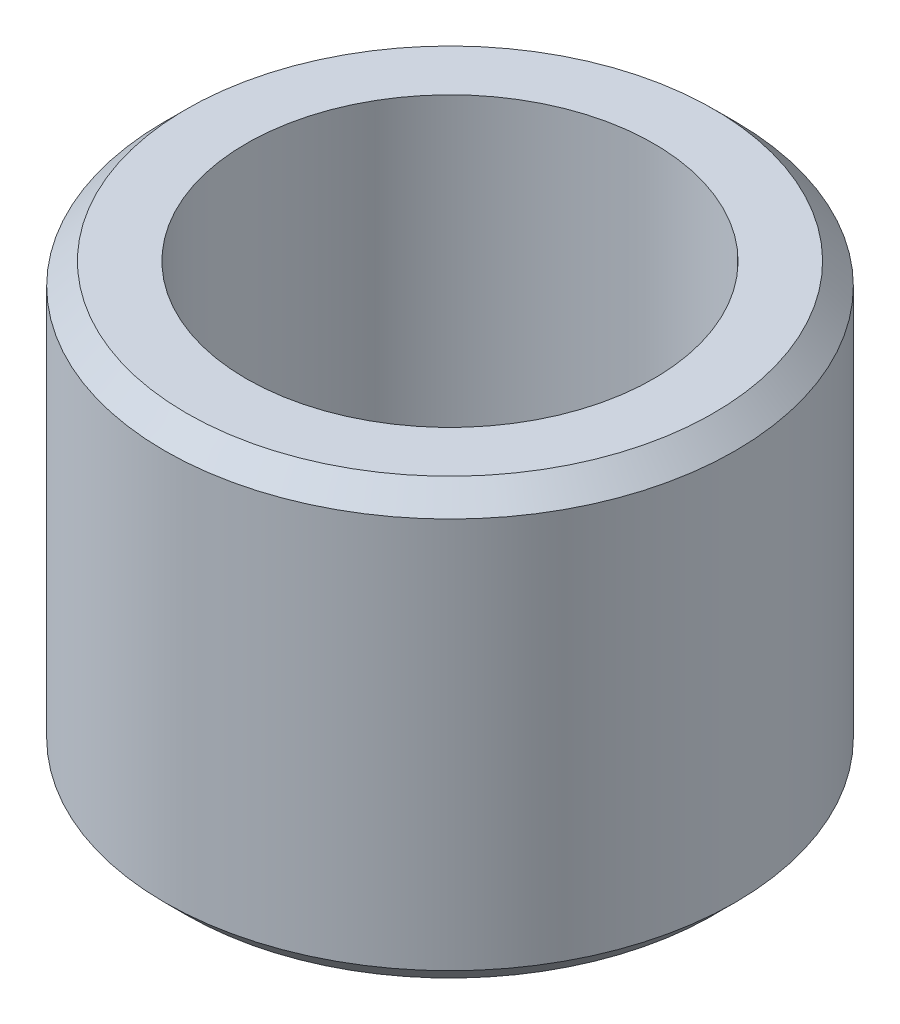
ISO-10303-21;
HEADER;
FILE_DESCRIPTION(('STEP AP214'),'2;1');
FILE_NAME('part.step','',(''),(''),'','','');
FILE_SCHEMA(('AUTOMOTIVE_DESIGN { 1 0 10303 214 1 1 1 1 }'));
ENDSEC;
DATA;
#1=APPLICATION_CONTEXT('core data for automotive mechanical design processes');
#2=APPLICATION_PROTOCOL_DEFINITION('international standard','automotive_design',2000,#1);
#3=PRODUCT_CONTEXT('',#1,'mechanical');
#4=PRODUCT('Part','Part','',(#3));
#5=PRODUCT_RELATED_PRODUCT_CATEGORY('part','',(#4));
#6=PRODUCT_DEFINITION_FORMATION('','',#4);
#7=PRODUCT_DEFINITION_CONTEXT('part definition',#1,'design');
#8=PRODUCT_DEFINITION('design','',#6,#7);
#9=PRODUCT_DEFINITION_SHAPE('','',#8);
#10=(LENGTH_UNIT() NAMED_UNIT(*) SI_UNIT(.MILLI.,.METRE.));
#11=(NAMED_UNIT(*) PLANE_ANGLE_UNIT() SI_UNIT($,.RADIAN.));
#12=(NAMED_UNIT(*) SI_UNIT($,.STERADIAN.) SOLID_ANGLE_UNIT());
#13=UNCERTAINTY_MEASURE_WITH_UNIT(LENGTH_MEASURE(1.E-05),#10,'distance_accuracy_value','');
#14=(GEOMETRIC_REPRESENTATION_CONTEXT(3) GLOBAL_UNCERTAINTY_ASSIGNED_CONTEXT((#13)) GLOBAL_UNIT_ASSIGNED_CONTEXT((#10,
#11,#12)) REPRESENTATION_CONTEXT('',''));
#15=CARTESIAN_POINT('',(0.,0.,0.));
#16=DIRECTION('',(0.,0.,1.));
#17=DIRECTION('',(1.,0.,0.));
#18=AXIS2_PLACEMENT_3D('',#15,#16,#17);
#19=CARTESIAN_POINT('',(0.,16.,0.));
#20=DIRECTION('',(0.,1.,0.));
#21=DIRECTION('',(0.,0.,1.));
#22=AXIS2_PLACEMENT_3D('',#19,#20,#21);
#23=PLANE('',#22);
#24=CARTESIAN_POINT('',(0.,16.,0.));
#25=DIRECTION('',(0.,1.,0.));
#26=DIRECTION('',(0.,0.,1.));
#27=AXIS2_PLACEMENT_3D('',#24,#25,#26);
#28=CIRCLE('',#27,9.70000000000001);
#29=CARTESIAN_POINT('',(0.,16.,9.70000000000001));
#30=VERTEX_POINT('',#29);
#31=EDGE_CURVE('E51',#30,#30,#28,.T.);
#32=ORIENTED_EDGE('',*,*,#31,.T.);
#33=EDGE_LOOP('',(#32));
#34=FACE_BOUND('',#33,.T.);
#35=CARTESIAN_POINT('',(0.,16.,0.));
#36=DIRECTION('',(0.,1.,0.));
#37=DIRECTION('',(0.,0.,1.));
#38=AXIS2_PLACEMENT_3D('',#35,#36,#37);
#39=CIRCLE('',#38,7.5);
#40=CARTESIAN_POINT('',(0.,16.,7.5));
#41=VERTEX_POINT('',#40);
#42=EDGE_CURVE('E56',#41,#41,#39,.T.);
#43=ORIENTED_EDGE('',*,*,#42,.F.);
#44=EDGE_LOOP('',(#43));
#45=FACE_BOUND('',#44,.T.);
#46=ADVANCED_FACE('F35',(#34,#45),#23,.T.);
#47=CARTESIAN_POINT('',(0.,0.,0.));
#48=DIRECTION('',(0.,1.,0.));
#49=DIRECTION('',(0.,0.,1.));
#50=AXIS2_PLACEMENT_3D('',#47,#48,#49);
#51=PLANE('',#50);
#52=CARTESIAN_POINT('',(0.,0.,0.));
#53=DIRECTION('',(0.,1.,0.));
#54=DIRECTION('',(0.,0.,1.));
#55=AXIS2_PLACEMENT_3D('',#52,#53,#54);
#56=CIRCLE('',#55,9.7);
#57=CARTESIAN_POINT('',(0.,0.,9.7));
#58=VERTEX_POINT('',#57);
#59=EDGE_CURVE('E10',#58,#58,#56,.F.);
#60=ORIENTED_EDGE('',*,*,#59,.T.);
#61=EDGE_LOOP('',(#60));
#62=FACE_BOUND('',#61,.T.);
#63=CARTESIAN_POINT('',(0.,0.,0.));
#64=DIRECTION('',(0.,1.,0.));
#65=DIRECTION('',(0.,0.,1.));
#66=AXIS2_PLACEMENT_3D('',#63,#64,#65);
#67=CIRCLE('',#66,7.5);
#68=CARTESIAN_POINT('',(0.,0.,7.5));
#69=VERTEX_POINT('',#68);
#70=EDGE_CURVE('E57',#69,#69,#67,.T.);
#71=ORIENTED_EDGE('',*,*,#70,.T.);
#72=EDGE_LOOP('',(#71));
#73=FACE_BOUND('',#72,.T.);
#74=ADVANCED_FACE('F67',(#62,#73),#51,.F.);
#75=CARTESIAN_POINT('',(0.,16.,0.));
#76=DIRECTION('',(0.,-1.,0.));
#77=DIRECTION('',(0.,0.,-1.));
#78=AXIS2_PLACEMENT_3D('',#75,#76,#77);
#79=CYLINDRICAL_SURFACE('',#78,10.5);
#80=CARTESIAN_POINT('',(0.,15.2,0.));
#81=DIRECTION('',(0.,1.,0.));
#82=DIRECTION('',(0.,0.,1.));
#83=AXIS2_PLACEMENT_3D('',#80,#81,#82);
#84=CIRCLE('',#83,10.5);
#85=CARTESIAN_POINT('',(0.,15.2,10.5));
#86=VERTEX_POINT('',#85);
#87=EDGE_CURVE('E43',#86,#86,#84,.F.);
#88=ORIENTED_EDGE('',*,*,#87,.T.);
#89=EDGE_LOOP('',(#88));
#90=FACE_BOUND('',#89,.T.);
#91=CARTESIAN_POINT('',(0.,0.799999999999992,0.));
#92=DIRECTION('',(0.,1.,0.));
#93=DIRECTION('',(0.,0.,1.));
#94=AXIS2_PLACEMENT_3D('',#91,#92,#93);
#95=CIRCLE('',#94,10.5);
#96=CARTESIAN_POINT('',(0.,0.799999999999992,10.5));
#97=VERTEX_POINT('',#96);
#98=EDGE_CURVE('E47',#97,#97,#95,.T.);
#99=ORIENTED_EDGE('',*,*,#98,.T.);
#100=EDGE_LOOP('',(#99));
#101=FACE_BOUND('',#100,.T.);
#102=ADVANCED_FACE('F74',(#90,#101),#79,.T.);
#103=CARTESIAN_POINT('',(0.,16.,0.));
#104=DIRECTION('',(0.,-1.,0.));
#105=DIRECTION('',(0.,0.,-1.));
#106=AXIS2_PLACEMENT_3D('',#103,#104,#105);
#107=CYLINDRICAL_SURFACE('',#106,7.5);
#108=ORIENTED_EDGE('',*,*,#42,.T.);
#109=EDGE_LOOP('',(#108));
#110=FACE_BOUND('',#109,.T.);
#111=ORIENTED_EDGE('',*,*,#70,.F.);
#112=EDGE_LOOP('',(#111));
#113=FACE_BOUND('',#112,.T.);
#114=ADVANCED_FACE('F63',(#110,#113),#107,.F.);
#115=CARTESIAN_POINT('',(0.,16.,0.));
#116=DIRECTION('',(0.,-1.,0.));
#117=DIRECTION('',(0.,0.,-1.));
#118=AXIS2_PLACEMENT_3D('',#115,#116,#117);
#119=CONICAL_SURFACE('',#118,9.70000000000001,0.785398163397445);
#120=ORIENTED_EDGE('',*,*,#87,.F.);
#121=EDGE_LOOP('',(#120));
#122=FACE_BOUND('',#121,.T.);
#123=ORIENTED_EDGE('',*,*,#31,.F.);
#124=EDGE_LOOP('',(#123));
#125=FACE_BOUND('',#124,.T.);
#126=ADVANCED_FACE('F80',(#122,#125),#119,.T.);
#127=CARTESIAN_POINT('',(0.,0.799999999999992,0.));
#128=DIRECTION('',(0.,1.,0.));
#129=DIRECTION('',(0.,0.,1.));
#130=AXIS2_PLACEMENT_3D('',#127,#128,#129);
#131=CONICAL_SURFACE('',#130,10.5,0.785398163397453);
#132=ORIENTED_EDGE('',*,*,#59,.F.);
#133=EDGE_LOOP('',(#132));
#134=FACE_BOUND('',#133,.T.);
#135=ORIENTED_EDGE('',*,*,#98,.F.);
#136=EDGE_LOOP('',(#135));
#137=FACE_BOUND('',#136,.T.);
#138=ADVANCED_FACE('F38',(#134,#137),#131,.T.);
#139=CLOSED_SHELL('',(#46,#74,#102,#114,#126,#138));
#140=MANIFOLD_SOLID_BREP('B2',#139);
#141=ADVANCED_BREP_SHAPE_REPRESENTATION('',(#18,#140),#14);
#142=SHAPE_DEFINITION_REPRESENTATION(#9,#141);
ENDSEC;
END-ISO-10303-21;
